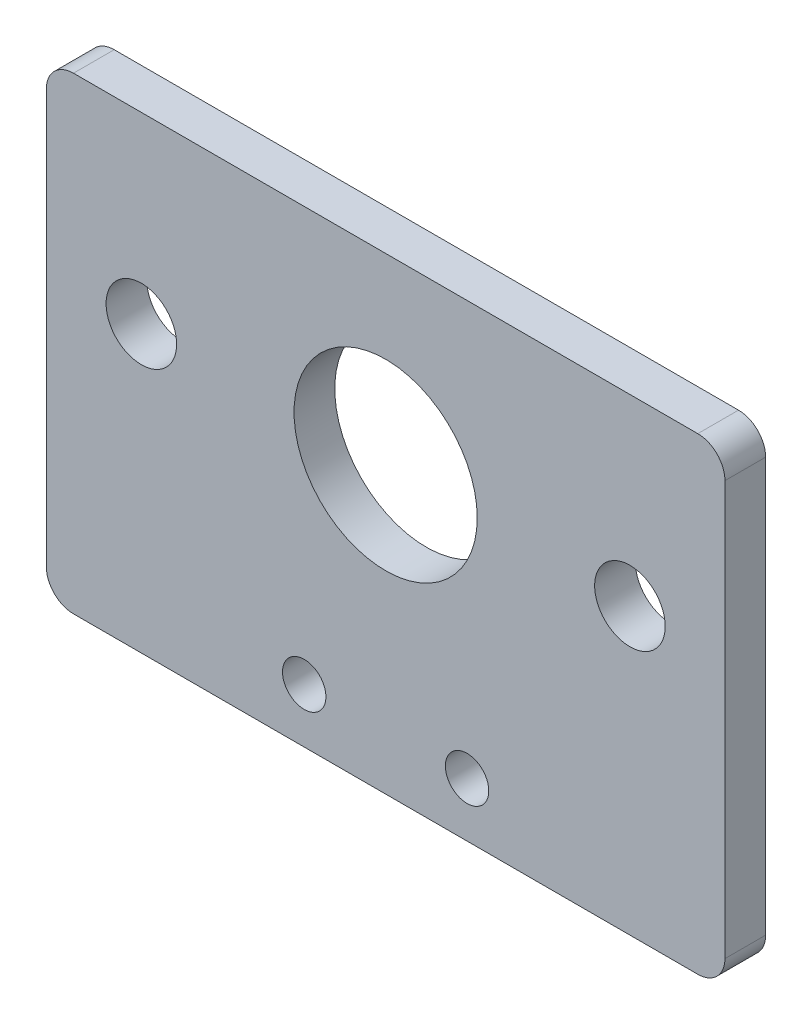
ISO-10303-21;
HEADER;
FILE_DESCRIPTION(('STEP AP214'),'2;1');
FILE_NAME('part.step','',(''),(''),'','','');
FILE_SCHEMA(('AUTOMOTIVE_DESIGN { 1 0 10303 214 1 1 1 1 }'));
ENDSEC;
DATA;
#1=APPLICATION_CONTEXT('core data for automotive mechanical design processes');
#2=APPLICATION_PROTOCOL_DEFINITION('international standard','automotive_design',2000,#1);
#3=PRODUCT_CONTEXT('',#1,'mechanical');
#4=PRODUCT('Part','Part','',(#3));
#5=PRODUCT_RELATED_PRODUCT_CATEGORY('part','',(#4));
#6=PRODUCT_DEFINITION_FORMATION('','',#4);
#7=PRODUCT_DEFINITION_CONTEXT('part definition',#1,'design');
#8=PRODUCT_DEFINITION('design','',#6,#7);
#9=PRODUCT_DEFINITION_SHAPE('','',#8);
#10=(LENGTH_UNIT() NAMED_UNIT(*) SI_UNIT(.MILLI.,.METRE.));
#11=(NAMED_UNIT(*) PLANE_ANGLE_UNIT() SI_UNIT($,.RADIAN.));
#12=(NAMED_UNIT(*) SI_UNIT($,.STERADIAN.) SOLID_ANGLE_UNIT());
#13=UNCERTAINTY_MEASURE_WITH_UNIT(LENGTH_MEASURE(1.E-05),#10,'distance_accuracy_value','');
#14=(GEOMETRIC_REPRESENTATION_CONTEXT(3) GLOBAL_UNCERTAINTY_ASSIGNED_CONTEXT((#13)) GLOBAL_UNIT_ASSIGNED_CONTEXT((#10,
#11,#12)) REPRESENTATION_CONTEXT('',''));
#15=CARTESIAN_POINT('',(0.,0.,0.));
#16=DIRECTION('',(0.,0.,1.));
#17=DIRECTION('',(1.,0.,0.));
#18=AXIS2_PLACEMENT_3D('',#15,#16,#17);
#19=CARTESIAN_POINT('',(48.,-2.,3.));
#20=DIRECTION('',(0.,0.,-1.));
#21=DIRECTION('',(-1.,0.,0.));
#22=AXIS2_PLACEMENT_3D('',#19,#20,#21);
#23=PLANE('',#22);
#24=CARTESIAN_POINT('',(31.,-38.,3.));
#25=DIRECTION('',(0.,0.,-1.));
#26=DIRECTION('',(-1.,0.,0.));
#27=AXIS2_PLACEMENT_3D('',#24,#25,#26);
#28=CIRCLE('',#27,1.6);
#29=CARTESIAN_POINT('',(29.4,-38.,3.));
#30=VERTEX_POINT('',#29);
#31=EDGE_CURVE('E193',#30,#30,#28,.T.);
#32=ORIENTED_EDGE('',*,*,#31,.T.);
#33=EDGE_LOOP('',(#32));
#34=FACE_BOUND('',#33,.T.);
#35=CARTESIAN_POINT('',(19.,-38.,3.));
#36=DIRECTION('',(0.,0.,-1.));
#37=DIRECTION('',(-1.,0.,0.));
#38=AXIS2_PLACEMENT_3D('',#35,#36,#37);
#39=CIRCLE('',#38,1.6);
#40=CARTESIAN_POINT('',(17.4,-38.,3.));
#41=VERTEX_POINT('',#40);
#42=EDGE_CURVE('E188',#41,#41,#39,.T.);
#43=ORIENTED_EDGE('',*,*,#42,.T.);
#44=EDGE_LOOP('',(#43));
#45=FACE_BOUND('',#44,.T.);
#46=DIRECTION('',(0.,1.,0.));
#47=VECTOR('',#46,1.);
#48=CARTESIAN_POINT('',(50.,-2.,3.));
#49=LINE('',#48,#47);
#50=CARTESIAN_POINT('',(50.,-40.,3.));
#51=VERTEX_POINT('',#50);
#52=CARTESIAN_POINT('',(50.,-9.5,3.));
#53=VERTEX_POINT('',#52);
#54=EDGE_CURVE('E135',#51,#53,#49,.T.);
#55=ORIENTED_EDGE('',*,*,#54,.T.);
#56=CARTESIAN_POINT('',(48.,-9.5,3.));
#57=DIRECTION('',(0.,0.,-1.));
#58=DIRECTION('',(-1.,0.,0.));
#59=AXIS2_PLACEMENT_3D('',#56,#57,#58);
#60=CIRCLE('',#59,2.);
#61=CARTESIAN_POINT('',(48.,-7.5,3.));
#62=VERTEX_POINT('',#61);
#63=EDGE_CURVE('E157',#53,#62,#60,.F.);
#64=ORIENTED_EDGE('',*,*,#63,.T.);
#65=DIRECTION('',(1.,0.,0.));
#66=VECTOR('',#65,1.);
#67=CARTESIAN_POINT('',(-5.87391061451168,-7.5,3.));
#68=LINE('',#67,#66);
#69=CARTESIAN_POINT('',(2.00000000000001,-7.5,3.));
#70=VERTEX_POINT('',#69);
#71=EDGE_CURVE('E178',#70,#62,#68,.T.);
#72=ORIENTED_EDGE('',*,*,#71,.F.);
#73=CARTESIAN_POINT('',(2.00000000000001,-9.5,3.));
#74=DIRECTION('',(0.,0.,-1.));
#75=DIRECTION('',(-1.,0.,0.));
#76=AXIS2_PLACEMENT_3D('',#73,#74,#75);
#77=CIRCLE('',#76,2.);
#78=CARTESIAN_POINT('',(0.,-9.5,3.));
#79=VERTEX_POINT('',#78);
#80=EDGE_CURVE('E112',#70,#79,#77,.F.);
#81=ORIENTED_EDGE('',*,*,#80,.T.);
#82=DIRECTION('',(0.,-1.,0.));
#83=VECTOR('',#82,1.);
#84=CARTESIAN_POINT('',(0.,-2.00000000000001,3.));
#85=LINE('',#84,#83);
#86=CARTESIAN_POINT('',(0.,-40.,3.));
#87=VERTEX_POINT('',#86);
#88=EDGE_CURVE('E103',#79,#87,#85,.T.);
#89=ORIENTED_EDGE('',*,*,#88,.T.);
#90=CARTESIAN_POINT('',(2.00000000000001,-40.,3.));
#91=DIRECTION('',(0.,0.,1.));
#92=DIRECTION('',(1.,0.,0.));
#93=AXIS2_PLACEMENT_3D('',#90,#91,#92);
#94=CIRCLE('',#93,2.);
#95=CARTESIAN_POINT('',(2.,-42.,3.));
#96=VERTEX_POINT('',#95);
#97=EDGE_CURVE('E108',#87,#96,#94,.T.);
#98=ORIENTED_EDGE('',*,*,#97,.T.);
#99=DIRECTION('',(1.,0.,0.));
#100=VECTOR('',#99,1.);
#101=CARTESIAN_POINT('',(2.00000000000001,-42.,3.));
#102=LINE('',#101,#100);
#103=CARTESIAN_POINT('',(48.,-42.,3.));
#104=VERTEX_POINT('',#103);
#105=EDGE_CURVE('E128',#96,#104,#102,.T.);
#106=ORIENTED_EDGE('',*,*,#105,.T.);
#107=CARTESIAN_POINT('',(48.,-40.,3.));
#108=DIRECTION('',(0.,0.,1.));
#109=DIRECTION('',(1.,0.,0.));
#110=AXIS2_PLACEMENT_3D('',#107,#108,#109);
#111=CIRCLE('',#110,2.00000000000001);
#112=EDGE_CURVE('E130',#104,#51,#111,.T.);
#113=ORIENTED_EDGE('',*,*,#112,.T.);
#114=EDGE_LOOP('',(#55,#64,#72,#81,#89,#98,#106,#113));
#115=FACE_BOUND('',#114,.T.);
#116=CARTESIAN_POINT('',(25.,-21.,3.));
#117=DIRECTION('',(0.,0.,1.));
#118=DIRECTION('',(1.,0.,0.));
#119=AXIS2_PLACEMENT_3D('',#116,#117,#118);
#120=CIRCLE('',#119,6.75);
#121=CARTESIAN_POINT('',(31.75,-21.,3.));
#122=VERTEX_POINT('',#121);
#123=EDGE_CURVE('E140',#122,#122,#120,.T.);
#124=ORIENTED_EDGE('',*,*,#123,.F.);
#125=EDGE_LOOP('',(#124));
#126=FACE_BOUND('',#125,.T.);
#127=CARTESIAN_POINT('',(43.,-21.,3.));
#128=DIRECTION('',(0.,0.,1.));
#129=DIRECTION('',(1.,0.,0.));
#130=AXIS2_PLACEMENT_3D('',#127,#128,#129);
#131=CIRCLE('',#130,2.6);
#132=CARTESIAN_POINT('',(45.6,-21.,3.));
#133=VERTEX_POINT('',#132);
#134=EDGE_CURVE('E203',#133,#133,#131,.T.);
#135=ORIENTED_EDGE('',*,*,#134,.F.);
#136=EDGE_LOOP('',(#135));
#137=FACE_BOUND('',#136,.T.);
#138=CARTESIAN_POINT('',(7.00000000000001,-21.,3.));
#139=DIRECTION('',(0.,0.,1.));
#140=DIRECTION('',(-1.,0.,0.));
#141=AXIS2_PLACEMENT_3D('',#138,#139,#140);
#142=CIRCLE('',#141,2.6);
#143=CARTESIAN_POINT('',(4.40000000000001,-21.,3.));
#144=VERTEX_POINT('',#143);
#145=EDGE_CURVE('E197',#144,#144,#142,.T.);
#146=ORIENTED_EDGE('',*,*,#145,.F.);
#147=EDGE_LOOP('',(#146));
#148=FACE_BOUND('',#147,.T.);
#149=ADVANCED_FACE('F39',(#34,#45,#115,#126,#137,#148),#23,.F.);
#150=CARTESIAN_POINT('',(48.,-2.,0.));
#151=DIRECTION('',(0.,0.,-1.));
#152=DIRECTION('',(-1.,0.,0.));
#153=AXIS2_PLACEMENT_3D('',#150,#151,#152);
#154=PLANE('',#153);
#155=DIRECTION('',(-1.,0.,0.));
#156=VECTOR('',#155,1.);
#157=CARTESIAN_POINT('',(48.,-7.5,0.));
#158=LINE('',#157,#156);
#159=CARTESIAN_POINT('',(48.,-7.5,0.));
#160=VERTEX_POINT('',#159);
#161=CARTESIAN_POINT('',(2.,-7.5,0.));
#162=VERTEX_POINT('',#161);
#163=EDGE_CURVE('E168',#160,#162,#158,.T.);
#164=ORIENTED_EDGE('',*,*,#163,.F.);
#165=CARTESIAN_POINT('',(48.,-9.5,0.));
#166=DIRECTION('',(0.,0.,-1.));
#167=DIRECTION('',(-1.,0.,0.));
#168=AXIS2_PLACEMENT_3D('',#165,#166,#167);
#169=CIRCLE('',#168,2.);
#170=CARTESIAN_POINT('',(50.,-9.5,0.));
#171=VERTEX_POINT('',#170);
#172=EDGE_CURVE('E47',#160,#171,#169,.T.);
#173=ORIENTED_EDGE('',*,*,#172,.T.);
#174=DIRECTION('',(0.,1.,0.));
#175=VECTOR('',#174,1.);
#176=CARTESIAN_POINT('',(50.,-2.,0.));
#177=LINE('',#176,#175);
#178=CARTESIAN_POINT('',(50.,-40.,0.));
#179=VERTEX_POINT('',#178);
#180=EDGE_CURVE('E114',#179,#171,#177,.T.);
#181=ORIENTED_EDGE('',*,*,#180,.F.);
#182=CARTESIAN_POINT('',(48.,-40.,0.));
#183=DIRECTION('',(0.,0.,1.));
#184=DIRECTION('',(1.,0.,0.));
#185=AXIS2_PLACEMENT_3D('',#182,#183,#184);
#186=CIRCLE('',#185,2.00000000000001);
#187=CARTESIAN_POINT('',(48.,-42.,0.));
#188=VERTEX_POINT('',#187);
#189=EDGE_CURVE('E144',#188,#179,#186,.T.);
#190=ORIENTED_EDGE('',*,*,#189,.F.);
#191=DIRECTION('',(1.,0.,0.));
#192=VECTOR('',#191,1.);
#193=CARTESIAN_POINT('',(2.00000000000001,-42.,0.));
#194=LINE('',#193,#192);
#195=CARTESIAN_POINT('',(2.,-42.,0.));
#196=VERTEX_POINT('',#195);
#197=EDGE_CURVE('E142',#196,#188,#194,.T.);
#198=ORIENTED_EDGE('',*,*,#197,.F.);
#199=CARTESIAN_POINT('',(2.00000000000001,-40.,0.));
#200=DIRECTION('',(0.,0.,1.));
#201=DIRECTION('',(1.,0.,0.));
#202=AXIS2_PLACEMENT_3D('',#199,#200,#201);
#203=CIRCLE('',#202,2.);
#204=CARTESIAN_POINT('',(0.,-40.,0.));
#205=VERTEX_POINT('',#204);
#206=EDGE_CURVE('E139',#205,#196,#203,.T.);
#207=ORIENTED_EDGE('',*,*,#206,.F.);
#208=DIRECTION('',(0.,-1.,0.));
#209=VECTOR('',#208,1.);
#210=CARTESIAN_POINT('',(0.,-2.00000000000001,0.));
#211=LINE('',#210,#209);
#212=CARTESIAN_POINT('',(0.,-9.5,0.));
#213=VERTEX_POINT('',#212);
#214=EDGE_CURVE('E119',#213,#205,#211,.T.);
#215=ORIENTED_EDGE('',*,*,#214,.F.);
#216=CARTESIAN_POINT('',(2.00000000000001,-9.5,0.));
#217=DIRECTION('',(0.,0.,-1.));
#218=DIRECTION('',(-1.,0.,0.));
#219=AXIS2_PLACEMENT_3D('',#216,#217,#218);
#220=CIRCLE('',#219,2.);
#221=EDGE_CURVE('E54',#213,#162,#220,.T.);
#222=ORIENTED_EDGE('',*,*,#221,.T.);
#223=EDGE_LOOP('',(#164,#173,#181,#190,#198,#207,#215,#222));
#224=FACE_BOUND('',#223,.T.);
#225=CARTESIAN_POINT('',(31.,-38.,0.));
#226=DIRECTION('',(0.,0.,-1.));
#227=DIRECTION('',(-1.,0.,0.));
#228=AXIS2_PLACEMENT_3D('',#225,#226,#227);
#229=CIRCLE('',#228,1.6);
#230=CARTESIAN_POINT('',(29.4,-38.,0.));
#231=VERTEX_POINT('',#230);
#232=EDGE_CURVE('E185',#231,#231,#229,.T.);
#233=ORIENTED_EDGE('',*,*,#232,.F.);
#234=EDGE_LOOP('',(#233));
#235=FACE_BOUND('',#234,.T.);
#236=CARTESIAN_POINT('',(19.,-38.,0.));
#237=DIRECTION('',(0.,0.,-1.));
#238=DIRECTION('',(1.,0.,0.));
#239=AXIS2_PLACEMENT_3D('',#236,#237,#238);
#240=CIRCLE('',#239,1.6);
#241=CARTESIAN_POINT('',(20.6,-38.,0.));
#242=VERTEX_POINT('',#241);
#243=EDGE_CURVE('E182',#242,#242,#240,.T.);
#244=ORIENTED_EDGE('',*,*,#243,.F.);
#245=EDGE_LOOP('',(#244));
#246=FACE_BOUND('',#245,.T.);
#247=CARTESIAN_POINT('',(43.,-21.,0.));
#248=DIRECTION('',(0.,0.,1.));
#249=DIRECTION('',(1.,0.,0.));
#250=AXIS2_PLACEMENT_3D('',#247,#248,#249);
#251=CIRCLE('',#250,2.6);
#252=CARTESIAN_POINT('',(45.6,-21.,0.));
#253=VERTEX_POINT('',#252);
#254=EDGE_CURVE('E200',#253,#253,#251,.T.);
#255=ORIENTED_EDGE('',*,*,#254,.T.);
#256=EDGE_LOOP('',(#255));
#257=FACE_BOUND('',#256,.T.);
#258=CARTESIAN_POINT('',(25.,-21.,0.));
#259=DIRECTION('',(0.,0.,1.));
#260=DIRECTION('',(1.,0.,0.));
#261=AXIS2_PLACEMENT_3D('',#258,#259,#260);
#262=CIRCLE('',#261,6.75);
#263=CARTESIAN_POINT('',(31.75,-21.,0.));
#264=VERTEX_POINT('',#263);
#265=EDGE_CURVE('E206',#264,#264,#262,.T.);
#266=ORIENTED_EDGE('',*,*,#265,.T.);
#267=EDGE_LOOP('',(#266));
#268=FACE_BOUND('',#267,.T.);
#269=CARTESIAN_POINT('',(7.00000000000001,-21.,0.));
#270=DIRECTION('',(0.,0.,1.));
#271=DIRECTION('',(-1.,0.,0.));
#272=AXIS2_PLACEMENT_3D('',#269,#270,#271);
#273=CIRCLE('',#272,2.6);
#274=CARTESIAN_POINT('',(4.40000000000001,-21.,0.));
#275=VERTEX_POINT('',#274);
#276=EDGE_CURVE('E196',#275,#275,#273,.T.);
#277=ORIENTED_EDGE('',*,*,#276,.T.);
#278=EDGE_LOOP('',(#277));
#279=FACE_BOUND('',#278,.T.);
#280=ADVANCED_FACE('F165',(#224,#235,#246,#257,#268,#279),#154,.T.);
#281=CARTESIAN_POINT('',(0.,-2.00000000000001,3.));
#282=DIRECTION('',(1.,0.,0.));
#283=DIRECTION('',(0.,0.,-1.));
#284=AXIS2_PLACEMENT_3D('',#281,#282,#283);
#285=PLANE('',#284);
#286=ORIENTED_EDGE('',*,*,#88,.F.);
#287=DIRECTION('',(0.,0.,-1.));
#288=VECTOR('',#287,1.);
#289=CARTESIAN_POINT('',(0.,-9.5,3.));
#290=LINE('',#289,#288);
#291=EDGE_CURVE('E11',#79,#213,#290,.T.);
#292=ORIENTED_EDGE('',*,*,#291,.T.);
#293=ORIENTED_EDGE('',*,*,#214,.T.);
#294=DIRECTION('',(0.,0.,-1.));
#295=VECTOR('',#294,1.);
#296=CARTESIAN_POINT('',(0.,-40.,3.));
#297=LINE('',#296,#295);
#298=EDGE_CURVE('E117',#87,#205,#297,.T.);
#299=ORIENTED_EDGE('',*,*,#298,.F.);
#300=EDGE_LOOP('',(#286,#292,#293,#299));
#301=FACE_BOUND('',#300,.T.);
#302=ADVANCED_FACE('F118',(#301),#285,.F.);
#303=CARTESIAN_POINT('',(2.00000000000001,-40.,3.));
#304=DIRECTION('',(0.,0.,-1.));
#305=DIRECTION('',(-1.,0.,0.));
#306=AXIS2_PLACEMENT_3D('',#303,#304,#305);
#307=CYLINDRICAL_SURFACE('',#306,2.);
#308=ORIENTED_EDGE('',*,*,#206,.T.);
#309=DIRECTION('',(0.,0.,-1.));
#310=VECTOR('',#309,1.);
#311=CARTESIAN_POINT('',(2.,-42.,3.));
#312=LINE('',#311,#310);
#313=EDGE_CURVE('E123',#96,#196,#312,.T.);
#314=ORIENTED_EDGE('',*,*,#313,.F.);
#315=ORIENTED_EDGE('',*,*,#97,.F.);
#316=ORIENTED_EDGE('',*,*,#298,.T.);
#317=EDGE_LOOP('',(#308,#314,#315,#316));
#318=FACE_BOUND('',#317,.T.);
#319=ADVANCED_FACE('F125',(#318),#307,.T.);
#320=CARTESIAN_POINT('',(2.00000000000001,-42.,3.));
#321=DIRECTION('',(0.,1.,0.));
#322=DIRECTION('',(-1.,0.,0.));
#323=AXIS2_PLACEMENT_3D('',#320,#321,#322);
#324=PLANE('',#323);
#325=ORIENTED_EDGE('',*,*,#197,.T.);
#326=DIRECTION('',(0.,0.,-1.));
#327=VECTOR('',#326,1.);
#328=CARTESIAN_POINT('',(48.,-42.,3.));
#329=LINE('',#328,#327);
#330=EDGE_CURVE('E150',#104,#188,#329,.T.);
#331=ORIENTED_EDGE('',*,*,#330,.F.);
#332=ORIENTED_EDGE('',*,*,#105,.F.);
#333=ORIENTED_EDGE('',*,*,#313,.T.);
#334=EDGE_LOOP('',(#325,#331,#332,#333));
#335=FACE_BOUND('',#334,.T.);
#336=ADVANCED_FACE('F240',(#335),#324,.F.);
#337=CARTESIAN_POINT('',(48.,-40.,3.));
#338=DIRECTION('',(0.,0.,-1.));
#339=DIRECTION('',(-1.,0.,0.));
#340=AXIS2_PLACEMENT_3D('',#337,#338,#339);
#341=CYLINDRICAL_SURFACE('',#340,2.00000000000001);
#342=ORIENTED_EDGE('',*,*,#189,.T.);
#343=DIRECTION('',(0.,0.,-1.));
#344=VECTOR('',#343,1.);
#345=CARTESIAN_POINT('',(50.,-40.,3.));
#346=LINE('',#345,#344);
#347=EDGE_CURVE('E137',#51,#179,#346,.T.);
#348=ORIENTED_EDGE('',*,*,#347,.F.);
#349=ORIENTED_EDGE('',*,*,#112,.F.);
#350=ORIENTED_EDGE('',*,*,#330,.T.);
#351=EDGE_LOOP('',(#342,#348,#349,#350));
#352=FACE_BOUND('',#351,.T.);
#353=ADVANCED_FACE('F227',(#352),#341,.T.);
#354=CARTESIAN_POINT('',(50.,-2.,3.));
#355=DIRECTION('',(-1.,0.,0.));
#356=DIRECTION('',(0.,-1.,0.));
#357=AXIS2_PLACEMENT_3D('',#354,#355,#356);
#358=PLANE('',#357);
#359=ORIENTED_EDGE('',*,*,#180,.T.);
#360=DIRECTION('',(0.,0.,1.));
#361=VECTOR('',#360,1.);
#362=CARTESIAN_POINT('',(50.,-9.5,3.));
#363=LINE('',#362,#361);
#364=EDGE_CURVE('E122',#171,#53,#363,.T.);
#365=ORIENTED_EDGE('',*,*,#364,.T.);
#366=ORIENTED_EDGE('',*,*,#54,.F.);
#367=ORIENTED_EDGE('',*,*,#347,.T.);
#368=EDGE_LOOP('',(#359,#365,#366,#367));
#369=FACE_BOUND('',#368,.T.);
#370=ADVANCED_FACE('F173',(#369),#358,.F.);
#371=CARTESIAN_POINT('',(25.,-21.,3.));
#372=DIRECTION('',(0.,0.,-1.));
#373=DIRECTION('',(-1.,0.,0.));
#374=AXIS2_PLACEMENT_3D('',#371,#372,#373);
#375=CYLINDRICAL_SURFACE('',#374,6.75);
#376=ORIENTED_EDGE('',*,*,#123,.T.);
#377=EDGE_LOOP('',(#376));
#378=FACE_BOUND('',#377,.T.);
#379=ORIENTED_EDGE('',*,*,#265,.F.);
#380=EDGE_LOOP('',(#379));
#381=FACE_BOUND('',#380,.T.);
#382=ADVANCED_FACE('F215',(#378,#381),#375,.F.);
#383=CARTESIAN_POINT('',(43.,-21.,3.));
#384=DIRECTION('',(0.,0.,-1.));
#385=DIRECTION('',(-1.,0.,0.));
#386=AXIS2_PLACEMENT_3D('',#383,#384,#385);
#387=CYLINDRICAL_SURFACE('',#386,2.6);
#388=ORIENTED_EDGE('',*,*,#134,.T.);
#389=EDGE_LOOP('',(#388));
#390=FACE_BOUND('',#389,.T.);
#391=ORIENTED_EDGE('',*,*,#254,.F.);
#392=EDGE_LOOP('',(#391));
#393=FACE_BOUND('',#392,.T.);
#394=ADVANCED_FACE('F217',(#390,#393),#387,.F.);
#395=CARTESIAN_POINT('',(7.00000000000001,-21.,3.));
#396=DIRECTION('',(0.,0.,-1.));
#397=DIRECTION('',(-1.,0.,0.));
#398=AXIS2_PLACEMENT_3D('',#395,#396,#397);
#399=CYLINDRICAL_SURFACE('',#398,2.6);
#400=ORIENTED_EDGE('',*,*,#145,.T.);
#401=EDGE_LOOP('',(#400));
#402=FACE_BOUND('',#401,.T.);
#403=ORIENTED_EDGE('',*,*,#276,.F.);
#404=EDGE_LOOP('',(#403));
#405=FACE_BOUND('',#404,.T.);
#406=ADVANCED_FACE('F224',(#402,#405),#399,.F.);
#407=CARTESIAN_POINT('',(19.,-38.,10.));
#408=DIRECTION('',(0.,0.,-1.));
#409=DIRECTION('',(-1.,0.,0.));
#410=AXIS2_PLACEMENT_3D('',#407,#408,#409);
#411=CYLINDRICAL_SURFACE('',#410,1.6);
#412=ORIENTED_EDGE('',*,*,#243,.T.);
#413=EDGE_LOOP('',(#412));
#414=FACE_BOUND('',#413,.T.);
#415=ORIENTED_EDGE('',*,*,#42,.F.);
#416=EDGE_LOOP('',(#415));
#417=FACE_BOUND('',#416,.T.);
#418=ADVANCED_FACE('F258',(#414,#417),#411,.F.);
#419=CARTESIAN_POINT('',(31.,-38.,10.));
#420=DIRECTION('',(0.,0.,-1.));
#421=DIRECTION('',(-1.,0.,0.));
#422=AXIS2_PLACEMENT_3D('',#419,#420,#421);
#423=CYLINDRICAL_SURFACE('',#422,1.6);
#424=ORIENTED_EDGE('',*,*,#232,.T.);
#425=EDGE_LOOP('',(#424));
#426=FACE_BOUND('',#425,.T.);
#427=ORIENTED_EDGE('',*,*,#31,.F.);
#428=EDGE_LOOP('',(#427));
#429=FACE_BOUND('',#428,.T.);
#430=ADVANCED_FACE('F253',(#426,#429),#423,.F.);
#431=CARTESIAN_POINT('',(-5.87391061451168,-7.5,-7.));
#432=DIRECTION('',(0.,-1.,0.));
#433=DIRECTION('',(0.,0.,-1.));
#434=AXIS2_PLACEMENT_3D('',#431,#432,#433);
#435=PLANE('',#434);
#436=ORIENTED_EDGE('',*,*,#71,.T.);
#437=DIRECTION('',(0.,0.,1.));
#438=VECTOR('',#437,1.);
#439=CARTESIAN_POINT('',(48.,-7.5,-7.));
#440=LINE('',#439,#438);
#441=EDGE_CURVE('E161',#62,#160,#440,.F.);
#442=ORIENTED_EDGE('',*,*,#441,.T.);
#443=ORIENTED_EDGE('',*,*,#163,.T.);
#444=DIRECTION('',(0.,0.,-1.));
#445=VECTOR('',#444,1.);
#446=CARTESIAN_POINT('',(2.00000000000001,-7.5,-7.));
#447=LINE('',#446,#445);
#448=EDGE_CURVE('E159',#162,#70,#447,.F.);
#449=ORIENTED_EDGE('',*,*,#448,.T.);
#450=EDGE_LOOP('',(#436,#442,#443,#449));
#451=FACE_BOUND('',#450,.T.);
#452=ADVANCED_FACE('F180',(#451),#435,.F.);
#453=CARTESIAN_POINT('',(48.,-9.5,3.));
#454=DIRECTION('',(0.,0.,1.));
#455=DIRECTION('',(1.,0.,0.));
#456=AXIS2_PLACEMENT_3D('',#453,#454,#455);
#457=CYLINDRICAL_SURFACE('',#456,2.);
#458=ORIENTED_EDGE('',*,*,#172,.F.);
#459=ORIENTED_EDGE('',*,*,#441,.F.);
#460=ORIENTED_EDGE('',*,*,#63,.F.);
#461=ORIENTED_EDGE('',*,*,#364,.F.);
#462=EDGE_LOOP('',(#458,#459,#460,#461));
#463=FACE_BOUND('',#462,.T.);
#464=ADVANCED_FACE('F176',(#463),#457,.T.);
#465=CARTESIAN_POINT('',(2.00000000000001,-9.5,3.));
#466=DIRECTION('',(0.,0.,-1.));
#467=DIRECTION('',(-1.,0.,0.));
#468=AXIS2_PLACEMENT_3D('',#465,#466,#467);
#469=CYLINDRICAL_SURFACE('',#468,2.);
#470=ORIENTED_EDGE('',*,*,#80,.F.);
#471=ORIENTED_EDGE('',*,*,#448,.F.);
#472=ORIENTED_EDGE('',*,*,#221,.F.);
#473=ORIENTED_EDGE('',*,*,#291,.F.);
#474=EDGE_LOOP('',(#470,#471,#472,#473));
#475=FACE_BOUND('',#474,.T.);
#476=ADVANCED_FACE('F41',(#475),#469,.T.);
#477=CLOSED_SHELL('',(#149,#280,#302,#319,#336,#353,#370,#382,#394,#406,#418,#430,#452,#464,#476));
#478=MANIFOLD_SOLID_BREP('B2',#477);
#479=ADVANCED_BREP_SHAPE_REPRESENTATION('',(#18,#478),#14);
#480=SHAPE_DEFINITION_REPRESENTATION(#9,#479);
ENDSEC;
END-ISO-10303-21;
